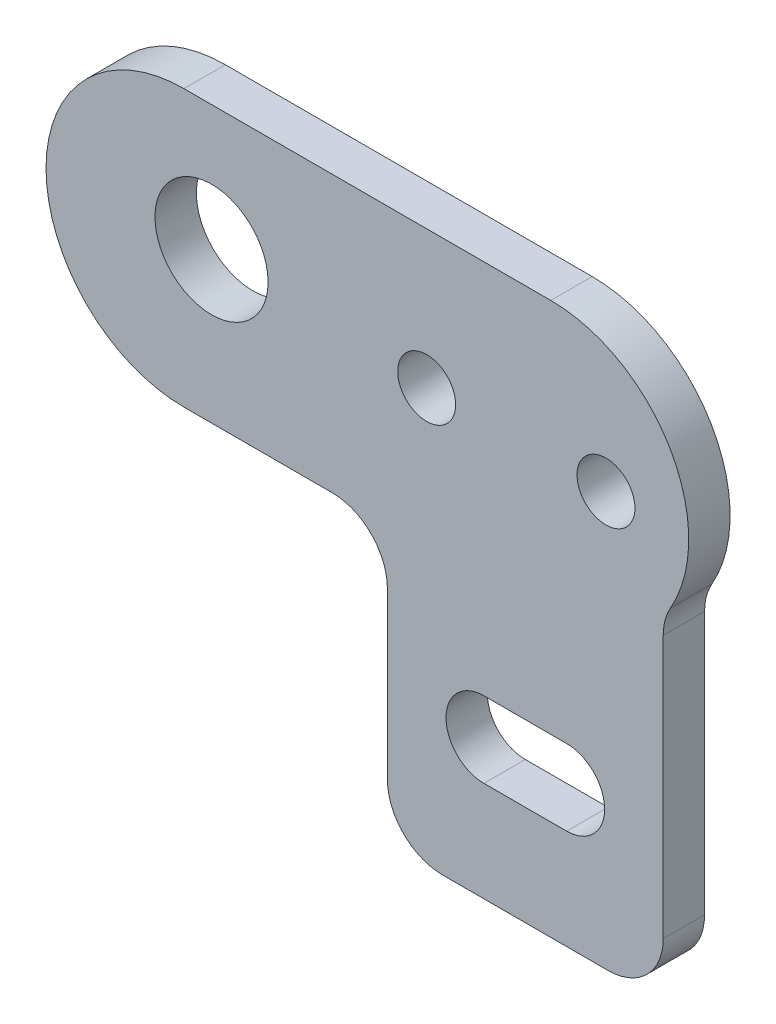
ISO-10303-21;
HEADER;
FILE_DESCRIPTION(('STEP AP214'),'2;1');
FILE_NAME('part.step','',(''),(''),'','','');
FILE_SCHEMA(('AUTOMOTIVE_DESIGN { 1 0 10303 214 1 1 1 1 }'));
ENDSEC;
DATA;
#1=APPLICATION_CONTEXT('core data for automotive mechanical design processes');
#2=APPLICATION_PROTOCOL_DEFINITION('international standard','automotive_design',2000,#1);
#3=PRODUCT_CONTEXT('',#1,'mechanical');
#4=PRODUCT('Part','Part','',(#3));
#5=PRODUCT_RELATED_PRODUCT_CATEGORY('part','',(#4));
#6=PRODUCT_DEFINITION_FORMATION('','',#4);
#7=PRODUCT_DEFINITION_CONTEXT('part definition',#1,'design');
#8=PRODUCT_DEFINITION('design','',#6,#7);
#9=PRODUCT_DEFINITION_SHAPE('','',#8);
#10=(LENGTH_UNIT() NAMED_UNIT(*) SI_UNIT(.MILLI.,.METRE.));
#11=(NAMED_UNIT(*) PLANE_ANGLE_UNIT() SI_UNIT($,.RADIAN.));
#12=(NAMED_UNIT(*) SI_UNIT($,.STERADIAN.) SOLID_ANGLE_UNIT());
#13=UNCERTAINTY_MEASURE_WITH_UNIT(LENGTH_MEASURE(1.E-05),#10,'distance_accuracy_value','');
#14=(GEOMETRIC_REPRESENTATION_CONTEXT(3) GLOBAL_UNCERTAINTY_ASSIGNED_CONTEXT((#13)) GLOBAL_UNIT_ASSIGNED_CONTEXT((#10,
#11,#12)) REPRESENTATION_CONTEXT('',''));
#15=CARTESIAN_POINT('',(0.,0.,0.));
#16=DIRECTION('',(0.,0.,1.));
#17=DIRECTION('',(1.,0.,0.));
#18=AXIS2_PLACEMENT_3D('',#15,#16,#17);
#19=CARTESIAN_POINT('',(0.,-10.,1.5));
#20=DIRECTION('',(0.,1.,0.));
#21=DIRECTION('',(0.,0.,1.));
#22=AXIS2_PLACEMENT_3D('',#19,#20,#21);
#23=PLANE('',#22);
#24=DIRECTION('',(1.,0.,0.));
#25=VECTOR('',#24,1.);
#26=CARTESIAN_POINT('',(0.,-10.,-1.5));
#27=LINE('',#26,#25);
#28=CARTESIAN_POINT('',(-13.3,-10.,-1.5));
#29=VERTEX_POINT('',#28);
#30=CARTESIAN_POINT('',(-2.55,-10.,-1.5));
#31=VERTEX_POINT('',#30);
#32=EDGE_CURVE('E198',#29,#31,#27,.T.);
#33=ORIENTED_EDGE('',*,*,#32,.T.);
#34=DIRECTION('',(0.,0.,-1.));
#35=VECTOR('',#34,1.);
#36=CARTESIAN_POINT('',(-2.55,-10.,1.5));
#37=LINE('',#36,#35);
#38=CARTESIAN_POINT('',(-2.55,-10.,1.5));
#39=VERTEX_POINT('',#38);
#40=EDGE_CURVE('E247',#31,#39,#37,.F.);
#41=ORIENTED_EDGE('',*,*,#40,.T.);
#42=DIRECTION('',(1.,0.,0.));
#43=VECTOR('',#42,1.);
#44=CARTESIAN_POINT('',(0.,-10.,1.5));
#45=LINE('',#44,#43);
#46=CARTESIAN_POINT('',(-13.3,-10.,1.5));
#47=VERTEX_POINT('',#46);
#48=EDGE_CURVE('E177',#47,#39,#45,.T.);
#49=ORIENTED_EDGE('',*,*,#48,.F.);
#50=DIRECTION('',(0.,0.,-1.));
#51=VECTOR('',#50,1.);
#52=CARTESIAN_POINT('',(-13.3,-10.,1.5));
#53=LINE('',#52,#51);
#54=EDGE_CURVE('E197',#47,#29,#53,.T.);
#55=ORIENTED_EDGE('',*,*,#54,.T.);
#56=EDGE_LOOP('',(#33,#41,#49,#55));
#57=FACE_BOUND('',#56,.T.);
#58=ADVANCED_FACE('F32',(#57),#23,.F.);
#59=CARTESIAN_POINT('',(1.45,0.,1.5));
#60=DIRECTION('',(1.,0.,0.));
#61=DIRECTION('',(0.,1.,0.));
#62=AXIS2_PLACEMENT_3D('',#59,#60,#61);
#63=PLANE('',#62);
#64=DIRECTION('',(0.,-1.,0.));
#65=VECTOR('',#64,1.);
#66=CARTESIAN_POINT('',(1.45,0.,-1.5));
#67=LINE('',#66,#65);
#68=CARTESIAN_POINT('',(1.45,-14.,-1.5));
#69=VERTEX_POINT('',#68);
#70=CARTESIAN_POINT('',(1.45,-26.,-1.5));
#71=VERTEX_POINT('',#70);
#72=EDGE_CURVE('E201',#69,#71,#67,.T.);
#73=ORIENTED_EDGE('',*,*,#72,.T.);
#74=DIRECTION('',(0.,0.,-1.));
#75=VECTOR('',#74,1.);
#76=CARTESIAN_POINT('',(1.45,-26.,1.5));
#77=LINE('',#76,#75);
#78=CARTESIAN_POINT('',(1.45,-26.,1.5));
#79=VERTEX_POINT('',#78);
#80=EDGE_CURVE('E245',#71,#79,#77,.F.);
#81=ORIENTED_EDGE('',*,*,#80,.T.);
#82=DIRECTION('',(0.,-1.,0.));
#83=VECTOR('',#82,1.);
#84=CARTESIAN_POINT('',(1.45,0.,1.5));
#85=LINE('',#84,#83);
#86=CARTESIAN_POINT('',(1.45,-14.,1.5));
#87=VERTEX_POINT('',#86);
#88=EDGE_CURVE('E180',#87,#79,#85,.T.);
#89=ORIENTED_EDGE('',*,*,#88,.F.);
#90=DIRECTION('',(0.,0.,-1.));
#91=VECTOR('',#90,1.);
#92=CARTESIAN_POINT('',(1.45,-14.,-1.5));
#93=LINE('',#92,#91);
#94=EDGE_CURVE('E242',#87,#69,#93,.T.);
#95=ORIENTED_EDGE('',*,*,#94,.T.);
#96=EDGE_LOOP('',(#73,#81,#89,#95));
#97=FACE_BOUND('',#96,.T.);
#98=ADVANCED_FACE('F291',(#97),#63,.F.);
#99=CARTESIAN_POINT('',(0.,-30.,1.5));
#100=DIRECTION('',(0.,1.,0.));
#101=DIRECTION('',(0.,0.,1.));
#102=AXIS2_PLACEMENT_3D('',#99,#100,#101);
#103=PLANE('',#102);
#104=DIRECTION('',(1.,0.,0.));
#105=VECTOR('',#104,1.);
#106=CARTESIAN_POINT('',(0.,-30.,-1.5));
#107=LINE('',#106,#105);
#108=CARTESIAN_POINT('',(5.45,-30.,-1.5));
#109=VERTEX_POINT('',#108);
#110=CARTESIAN_POINT('',(17.45,-30.,-1.5));
#111=VERTEX_POINT('',#110);
#112=EDGE_CURVE('E205',#109,#111,#107,.T.);
#113=ORIENTED_EDGE('',*,*,#112,.T.);
#114=DIRECTION('',(0.,0.,-1.));
#115=VECTOR('',#114,1.);
#116=CARTESIAN_POINT('',(17.45,-30.,1.5));
#117=LINE('',#116,#115);
#118=CARTESIAN_POINT('',(17.45,-30.,1.5));
#119=VERTEX_POINT('',#118);
#120=EDGE_CURVE('E236',#111,#119,#117,.F.);
#121=ORIENTED_EDGE('',*,*,#120,.T.);
#122=DIRECTION('',(1.,0.,0.));
#123=VECTOR('',#122,1.);
#124=CARTESIAN_POINT('',(0.,-30.,1.5));
#125=LINE('',#124,#123);
#126=CARTESIAN_POINT('',(5.45,-30.,1.5));
#127=VERTEX_POINT('',#126);
#128=EDGE_CURVE('E184',#127,#119,#125,.T.);
#129=ORIENTED_EDGE('',*,*,#128,.F.);
#130=DIRECTION('',(0.,0.,-1.));
#131=VECTOR('',#130,1.);
#132=CARTESIAN_POINT('',(5.45,-30.,1.5));
#133=LINE('',#132,#131);
#134=EDGE_CURVE('E233',#127,#109,#133,.T.);
#135=ORIENTED_EDGE('',*,*,#134,.T.);
#136=EDGE_LOOP('',(#113,#121,#129,#135));
#137=FACE_BOUND('',#136,.T.);
#138=ADVANCED_FACE('F300',(#137),#103,.F.);
#139=CARTESIAN_POINT('',(21.45,0.,1.5));
#140=DIRECTION('',(-1.,0.,0.));
#141=DIRECTION('',(0.,-1.,0.));
#142=AXIS2_PLACEMENT_3D('',#139,#140,#141);
#143=PLANE('',#142);
#144=DIRECTION('',(0.,1.,0.));
#145=VECTOR('',#144,1.);
#146=CARTESIAN_POINT('',(21.45,0.,1.5));
#147=LINE('',#146,#145);
#148=CARTESIAN_POINT('',(21.45,-26.,1.5));
#149=VERTEX_POINT('',#148);
#150=CARTESIAN_POINT('',(21.45,-6.95539359058852,1.5));
#151=VERTEX_POINT('',#150);
#152=EDGE_CURVE('E187',#149,#151,#147,.T.);
#153=ORIENTED_EDGE('',*,*,#152,.F.);
#154=DIRECTION('',(0.,0.,-1.));
#155=VECTOR('',#154,1.);
#156=CARTESIAN_POINT('',(21.45,-26.,1.5));
#157=LINE('',#156,#155);
#158=CARTESIAN_POINT('',(21.45,-26.,-1.5));
#159=VERTEX_POINT('',#158);
#160=EDGE_CURVE('E226',#149,#159,#157,.T.);
#161=ORIENTED_EDGE('',*,*,#160,.T.);
#162=DIRECTION('',(0.,1.,0.));
#163=VECTOR('',#162,1.);
#164=CARTESIAN_POINT('',(21.45,0.,-1.5));
#165=LINE('',#164,#163);
#166=CARTESIAN_POINT('',(21.45,-6.95539359058852,-1.5));
#167=VERTEX_POINT('',#166);
#168=EDGE_CURVE('E208',#159,#167,#165,.T.);
#169=ORIENTED_EDGE('',*,*,#168,.T.);
#170=DIRECTION('',(0.,0.,1.));
#171=VECTOR('',#170,1.);
#172=CARTESIAN_POINT('',(21.45,-6.95539359058852,1.5));
#173=LINE('',#172,#171);
#174=EDGE_CURVE('E224',#167,#151,#173,.T.);
#175=ORIENTED_EDGE('',*,*,#174,.T.);
#176=EDGE_LOOP('',(#153,#161,#169,#175));
#177=FACE_BOUND('',#176,.T.);
#178=ADVANCED_FACE('F262',(#177),#143,.F.);
#179=CARTESIAN_POINT('',(13.3,0.,1.5));
#180=DIRECTION('',(0.,0.,-1.));
#181=DIRECTION('',(-1.,0.,0.));
#182=AXIS2_PLACEMENT_3D('',#179,#180,#181);
#183=CYLINDRICAL_SURFACE('',#182,10.);
#184=CARTESIAN_POINT('',(13.3,0.,1.5));
#185=DIRECTION('',(0.,0.,1.));
#186=DIRECTION('',(1.,0.,0.));
#187=AXIS2_PLACEMENT_3D('',#184,#185,#186);
#188=CIRCLE('',#187,10.);
#189=CARTESIAN_POINT('',(21.9785714285714,-4.9681382789918,1.5));
#190=VERTEX_POINT('',#189);
#191=CARTESIAN_POINT('',(13.3,10.,1.5));
#192=VERTEX_POINT('',#191);
#193=EDGE_CURVE('E190',#190,#192,#188,.T.);
#194=ORIENTED_EDGE('',*,*,#193,.F.);
#195=DIRECTION('',(0.,0.,-1.));
#196=VECTOR('',#195,1.);
#197=CARTESIAN_POINT('',(21.9785714285714,-4.9681382789918,1.5));
#198=LINE('',#197,#196);
#199=CARTESIAN_POINT('',(21.9785714285714,-4.9681382789918,-1.5));
#200=VERTEX_POINT('',#199);
#201=EDGE_CURVE('E249',#190,#200,#198,.T.);
#202=ORIENTED_EDGE('',*,*,#201,.T.);
#203=CARTESIAN_POINT('',(13.3,0.,-1.5));
#204=DIRECTION('',(0.,0.,1.));
#205=DIRECTION('',(1.,0.,0.));
#206=AXIS2_PLACEMENT_3D('',#203,#204,#205);
#207=CIRCLE('',#206,10.);
#208=CARTESIAN_POINT('',(13.3,10.,-1.5));
#209=VERTEX_POINT('',#208);
#210=EDGE_CURVE('E211',#200,#209,#207,.T.);
#211=ORIENTED_EDGE('',*,*,#210,.T.);
#212=DIRECTION('',(0.,0.,-1.));
#213=VECTOR('',#212,1.);
#214=CARTESIAN_POINT('',(13.3,10.,1.5));
#215=LINE('',#214,#213);
#216=EDGE_CURVE('E221',#192,#209,#215,.T.);
#217=ORIENTED_EDGE('',*,*,#216,.F.);
#218=EDGE_LOOP('',(#194,#202,#211,#217));
#219=FACE_BOUND('',#218,.T.);
#220=ADVANCED_FACE('F271',(#219),#183,.T.);
#221=CARTESIAN_POINT('',(0.,10.,1.5));
#222=DIRECTION('',(0.,1.,0.));
#223=DIRECTION('',(0.,0.,1.));
#224=AXIS2_PLACEMENT_3D('',#221,#222,#223);
#225=PLANE('',#224);
#226=DIRECTION('',(1.,0.,0.));
#227=VECTOR('',#226,1.);
#228=CARTESIAN_POINT('',(0.,10.,-1.5));
#229=LINE('',#228,#227);
#230=CARTESIAN_POINT('',(-13.3,10.,-1.5));
#231=VERTEX_POINT('',#230);
#232=EDGE_CURVE('E213',#231,#209,#229,.T.);
#233=ORIENTED_EDGE('',*,*,#232,.F.);
#234=DIRECTION('',(0.,0.,-1.));
#235=VECTOR('',#234,1.);
#236=CARTESIAN_POINT('',(-13.3,10.,1.5));
#237=LINE('',#236,#235);
#238=CARTESIAN_POINT('',(-13.3,10.,1.5));
#239=VERTEX_POINT('',#238);
#240=EDGE_CURVE('E219',#239,#231,#237,.T.);
#241=ORIENTED_EDGE('',*,*,#240,.F.);
#242=DIRECTION('',(1.,0.,0.));
#243=VECTOR('',#242,1.);
#244=CARTESIAN_POINT('',(0.,10.,1.5));
#245=LINE('',#244,#243);
#246=EDGE_CURVE('E192',#239,#192,#245,.T.);
#247=ORIENTED_EDGE('',*,*,#246,.T.);
#248=ORIENTED_EDGE('',*,*,#216,.T.);
#249=EDGE_LOOP('',(#233,#241,#247,#248));
#250=FACE_BOUND('',#249,.T.);
#251=ADVANCED_FACE('F274',(#250),#225,.T.);
#252=CARTESIAN_POINT('',(-13.3,0.,1.5));
#253=DIRECTION('',(0.,0.,-1.));
#254=DIRECTION('',(-1.,0.,0.));
#255=AXIS2_PLACEMENT_3D('',#252,#253,#254);
#256=CYLINDRICAL_SURFACE('',#255,10.);
#257=CARTESIAN_POINT('',(-13.3,0.,-1.5));
#258=DIRECTION('',(0.,0.,1.));
#259=DIRECTION('',(1.,0.,0.));
#260=AXIS2_PLACEMENT_3D('',#257,#258,#259);
#261=CIRCLE('',#260,10.);
#262=EDGE_CURVE('E181',#231,#29,#261,.T.);
#263=ORIENTED_EDGE('',*,*,#262,.T.);
#264=ORIENTED_EDGE('',*,*,#54,.F.);
#265=CARTESIAN_POINT('',(-13.3,0.,1.5));
#266=DIRECTION('',(0.,0.,1.));
#267=DIRECTION('',(1.,0.,0.));
#268=AXIS2_PLACEMENT_3D('',#265,#266,#267);
#269=CIRCLE('',#268,10.);
#270=EDGE_CURVE('E195',#239,#47,#269,.T.);
#271=ORIENTED_EDGE('',*,*,#270,.F.);
#272=ORIENTED_EDGE('',*,*,#240,.T.);
#273=EDGE_LOOP('',(#263,#264,#271,#272));
#274=FACE_BOUND('',#273,.T.);
#275=ADVANCED_FACE('F280',(#274),#256,.T.);
#276=CARTESIAN_POINT('',(0.,0.,1.5));
#277=DIRECTION('',(0.,0.,1.));
#278=DIRECTION('',(1.,0.,0.));
#279=AXIS2_PLACEMENT_3D('',#276,#277,#278);
#280=PLANE('',#279);
#281=CARTESIAN_POINT('',(-11.3,0.9,1.5));
#282=DIRECTION('',(0.,0.,1.));
#283=DIRECTION('',(1.,0.,0.));
#284=AXIS2_PLACEMENT_3D('',#281,#282,#283);
#285=CIRCLE('',#284,4.1);
#286=CARTESIAN_POINT('',(-7.2,0.9,1.5));
#287=VERTEX_POINT('',#286);
#288=EDGE_CURVE('E363',#287,#287,#285,.T.);
#289=ORIENTED_EDGE('',*,*,#288,.F.);
#290=EDGE_LOOP('',(#289));
#291=FACE_BOUND('',#290,.T.);
#292=CARTESIAN_POINT('',(4.3,0.,1.5));
#293=DIRECTION('',(0.,0.,1.));
#294=DIRECTION('',(1.,0.,0.));
#295=AXIS2_PLACEMENT_3D('',#292,#293,#294);
#296=CIRCLE('',#295,2.1);
#297=CARTESIAN_POINT('',(6.4,0.,1.5));
#298=VERTEX_POINT('',#297);
#299=EDGE_CURVE('E368',#298,#298,#296,.T.);
#300=ORIENTED_EDGE('',*,*,#299,.F.);
#301=EDGE_LOOP('',(#300));
#302=FACE_BOUND('',#301,.T.);
#303=CARTESIAN_POINT('',(17.3,0.,1.5));
#304=DIRECTION('',(0.,0.,1.));
#305=DIRECTION('',(1.,0.,0.));
#306=AXIS2_PLACEMENT_3D('',#303,#304,#305);
#307=CIRCLE('',#306,2.1);
#308=CARTESIAN_POINT('',(19.4,0.,1.5));
#309=VERTEX_POINT('',#308);
#310=EDGE_CURVE('E162',#309,#309,#307,.T.);
#311=ORIENTED_EDGE('',*,*,#310,.F.);
#312=EDGE_LOOP('',(#311));
#313=FACE_BOUND('',#312,.T.);
#314=CARTESIAN_POINT('',(8.45,-20.,1.5));
#315=DIRECTION('',(0.,0.,1.));
#316=DIRECTION('',(1.,0.,0.));
#317=AXIS2_PLACEMENT_3D('',#314,#315,#316);
#318=CIRCLE('',#317,2.75);
#319=CARTESIAN_POINT('',(8.45,-17.25,1.5));
#320=VERTEX_POINT('',#319);
#321=CARTESIAN_POINT('',(8.45,-22.75,1.5));
#322=VERTEX_POINT('',#321);
#323=EDGE_CURVE('E47',#320,#322,#318,.T.);
#324=ORIENTED_EDGE('',*,*,#323,.F.);
#325=DIRECTION('',(-1.,0.,0.));
#326=VECTOR('',#325,1.);
#327=CARTESIAN_POINT('',(8.45,-17.25,1.5));
#328=LINE('',#327,#326);
#329=CARTESIAN_POINT('',(14.45,-17.25,1.5));
#330=VERTEX_POINT('',#329);
#331=EDGE_CURVE('E156',#330,#320,#328,.T.);
#332=ORIENTED_EDGE('',*,*,#331,.F.);
#333=CARTESIAN_POINT('',(14.45,-20.,1.5));
#334=DIRECTION('',(0.,0.,1.));
#335=DIRECTION('',(1.,0.,0.));
#336=AXIS2_PLACEMENT_3D('',#333,#334,#335);
#337=CIRCLE('',#336,2.75);
#338=CARTESIAN_POINT('',(14.45,-22.75,1.5));
#339=VERTEX_POINT('',#338);
#340=EDGE_CURVE('E159',#339,#330,#337,.T.);
#341=ORIENTED_EDGE('',*,*,#340,.F.);
#342=DIRECTION('',(1.,0.,0.));
#343=VECTOR('',#342,1.);
#344=CARTESIAN_POINT('',(8.45,-22.75,1.5));
#345=LINE('',#344,#343);
#346=EDGE_CURVE('E168',#322,#339,#345,.T.);
#347=ORIENTED_EDGE('',*,*,#346,.F.);
#348=EDGE_LOOP('',(#324,#332,#341,#347));
#349=FACE_BOUND('',#348,.T.);
#350=ORIENTED_EDGE('',*,*,#128,.T.);
#351=CARTESIAN_POINT('',(17.45,-26.,1.5));
#352=DIRECTION('',(0.,0.,1.));
#353=DIRECTION('',(1.,0.,0.));
#354=AXIS2_PLACEMENT_3D('',#351,#352,#353);
#355=CIRCLE('',#354,4.);
#356=EDGE_CURVE('E240',#119,#149,#355,.T.);
#357=ORIENTED_EDGE('',*,*,#356,.T.);
#358=ORIENTED_EDGE('',*,*,#152,.T.);
#359=CARTESIAN_POINT('',(25.45,-6.95539359058852,1.5));
#360=DIRECTION('',(0.,0.,1.));
#361=DIRECTION('',(1.,0.,0.));
#362=AXIS2_PLACEMENT_3D('',#359,#360,#361);
#363=CIRCLE('',#362,4.);
#364=EDGE_CURVE('E11',#151,#190,#363,.F.);
#365=ORIENTED_EDGE('',*,*,#364,.T.);
#366=ORIENTED_EDGE('',*,*,#193,.T.);
#367=ORIENTED_EDGE('',*,*,#246,.F.);
#368=ORIENTED_EDGE('',*,*,#270,.T.);
#369=ORIENTED_EDGE('',*,*,#48,.T.);
#370=CARTESIAN_POINT('',(-2.55,-14.,1.5));
#371=DIRECTION('',(0.,0.,1.));
#372=DIRECTION('',(1.,0.,0.));
#373=AXIS2_PLACEMENT_3D('',#370,#371,#372);
#374=CIRCLE('',#373,4.);
#375=EDGE_CURVE('E254',#39,#87,#374,.F.);
#376=ORIENTED_EDGE('',*,*,#375,.T.);
#377=ORIENTED_EDGE('',*,*,#88,.T.);
#378=CARTESIAN_POINT('',(5.45,-26.,1.5));
#379=DIRECTION('',(0.,0.,1.));
#380=DIRECTION('',(1.,0.,0.));
#381=AXIS2_PLACEMENT_3D('',#378,#379,#380);
#382=CIRCLE('',#381,4.);
#383=EDGE_CURVE('E238',#79,#127,#382,.T.);
#384=ORIENTED_EDGE('',*,*,#383,.T.);
#385=EDGE_LOOP('',(#350,#357,#358,#365,#366,#367,#368,#369,#376,#377,#384));
#386=FACE_BOUND('',#385,.T.);
#387=ADVANCED_FACE('F267',(#291,#302,#313,#349,#386),#280,.T.);
#388=CARTESIAN_POINT('',(0.,0.,-1.5));
#389=DIRECTION('',(0.,0.,1.));
#390=DIRECTION('',(1.,0.,0.));
#391=AXIS2_PLACEMENT_3D('',#388,#389,#390);
#392=PLANE('',#391);
#393=CARTESIAN_POINT('',(-11.3,0.9,-1.5));
#394=DIRECTION('',(0.,0.,1.));
#395=DIRECTION('',(1.,0.,0.));
#396=AXIS2_PLACEMENT_3D('',#393,#394,#395);
#397=CIRCLE('',#396,4.1);
#398=CARTESIAN_POINT('',(-7.2,0.9,-1.5));
#399=VERTEX_POINT('',#398);
#400=EDGE_CURVE('E202',#399,#399,#397,.T.);
#401=ORIENTED_EDGE('',*,*,#400,.T.);
#402=EDGE_LOOP('',(#401));
#403=FACE_BOUND('',#402,.T.);
#404=CARTESIAN_POINT('',(4.3,0.,-1.5));
#405=DIRECTION('',(0.,0.,1.));
#406=DIRECTION('',(1.,0.,0.));
#407=AXIS2_PLACEMENT_3D('',#404,#405,#406);
#408=CIRCLE('',#407,2.1);
#409=CARTESIAN_POINT('',(6.4,0.,-1.5));
#410=VERTEX_POINT('',#409);
#411=EDGE_CURVE('E364',#410,#410,#408,.T.);
#412=ORIENTED_EDGE('',*,*,#411,.T.);
#413=EDGE_LOOP('',(#412));
#414=FACE_BOUND('',#413,.T.);
#415=CARTESIAN_POINT('',(17.3,0.,-1.5));
#416=DIRECTION('',(0.,0.,1.));
#417=DIRECTION('',(1.,0.,0.));
#418=AXIS2_PLACEMENT_3D('',#415,#416,#417);
#419=CIRCLE('',#418,2.1);
#420=CARTESIAN_POINT('',(19.4,0.,-1.5));
#421=VERTEX_POINT('',#420);
#422=EDGE_CURVE('E372',#421,#421,#419,.T.);
#423=ORIENTED_EDGE('',*,*,#422,.T.);
#424=EDGE_LOOP('',(#423));
#425=FACE_BOUND('',#424,.T.);
#426=DIRECTION('',(-1.,0.,0.));
#427=VECTOR('',#426,1.);
#428=CARTESIAN_POINT('',(8.45,-17.25,-1.5));
#429=LINE('',#428,#427);
#430=CARTESIAN_POINT('',(14.45,-17.25,-1.5));
#431=VERTEX_POINT('',#430);
#432=CARTESIAN_POINT('',(8.45,-17.25,-1.5));
#433=VERTEX_POINT('',#432);
#434=EDGE_CURVE('E146',#431,#433,#429,.T.);
#435=ORIENTED_EDGE('',*,*,#434,.T.);
#436=CARTESIAN_POINT('',(8.45,-20.,-1.5));
#437=DIRECTION('',(0.,0.,1.));
#438=DIRECTION('',(1.,0.,0.));
#439=AXIS2_PLACEMENT_3D('',#436,#437,#438);
#440=CIRCLE('',#439,2.75);
#441=CARTESIAN_POINT('',(8.45,-22.75,-1.5));
#442=VERTEX_POINT('',#441);
#443=EDGE_CURVE('E140',#433,#442,#440,.T.);
#444=ORIENTED_EDGE('',*,*,#443,.T.);
#445=DIRECTION('',(1.,0.,0.));
#446=VECTOR('',#445,1.);
#447=CARTESIAN_POINT('',(8.45,-22.75,-1.5));
#448=LINE('',#447,#446);
#449=CARTESIAN_POINT('',(14.45,-22.75,-1.5));
#450=VERTEX_POINT('',#449);
#451=EDGE_CURVE('E149',#442,#450,#448,.T.);
#452=ORIENTED_EDGE('',*,*,#451,.T.);
#453=CARTESIAN_POINT('',(14.45,-20.,-1.5));
#454=DIRECTION('',(0.,0.,1.));
#455=DIRECTION('',(1.,0.,0.));
#456=AXIS2_PLACEMENT_3D('',#453,#454,#455);
#457=CIRCLE('',#456,2.75);
#458=EDGE_CURVE('E55',#450,#431,#457,.T.);
#459=ORIENTED_EDGE('',*,*,#458,.T.);
#460=EDGE_LOOP('',(#435,#444,#452,#459));
#461=FACE_BOUND('',#460,.T.);
#462=ORIENTED_EDGE('',*,*,#168,.F.);
#463=CARTESIAN_POINT('',(17.45,-26.,-1.5));
#464=DIRECTION('',(0.,0.,1.));
#465=DIRECTION('',(1.,0.,0.));
#466=AXIS2_PLACEMENT_3D('',#463,#464,#465);
#467=CIRCLE('',#466,4.);
#468=EDGE_CURVE('E231',#159,#111,#467,.F.);
#469=ORIENTED_EDGE('',*,*,#468,.T.);
#470=ORIENTED_EDGE('',*,*,#112,.F.);
#471=CARTESIAN_POINT('',(5.45,-26.,-1.5));
#472=DIRECTION('',(0.,0.,1.));
#473=DIRECTION('',(1.,0.,0.));
#474=AXIS2_PLACEMENT_3D('',#471,#472,#473);
#475=CIRCLE('',#474,4.);
#476=EDGE_CURVE('E229',#109,#71,#475,.F.);
#477=ORIENTED_EDGE('',*,*,#476,.T.);
#478=ORIENTED_EDGE('',*,*,#72,.F.);
#479=CARTESIAN_POINT('',(-2.55,-14.,-1.5));
#480=DIRECTION('',(0.,0.,1.));
#481=DIRECTION('',(1.,0.,0.));
#482=AXIS2_PLACEMENT_3D('',#479,#480,#481);
#483=CIRCLE('',#482,4.);
#484=EDGE_CURVE('E252',#69,#31,#483,.T.);
#485=ORIENTED_EDGE('',*,*,#484,.T.);
#486=ORIENTED_EDGE('',*,*,#32,.F.);
#487=ORIENTED_EDGE('',*,*,#262,.F.);
#488=ORIENTED_EDGE('',*,*,#232,.T.);
#489=ORIENTED_EDGE('',*,*,#210,.F.);
#490=CARTESIAN_POINT('',(25.45,-6.95539359058852,-1.5));
#491=DIRECTION('',(0.,0.,1.));
#492=DIRECTION('',(1.,0.,0.));
#493=AXIS2_PLACEMENT_3D('',#490,#491,#492);
#494=CIRCLE('',#493,4.);
#495=EDGE_CURVE('E40',#200,#167,#494,.T.);
#496=ORIENTED_EDGE('',*,*,#495,.T.);
#497=EDGE_LOOP('',(#462,#469,#470,#477,#478,#485,#486,#487,#488,#489,#496));
#498=FACE_BOUND('',#497,.T.);
#499=ADVANCED_FACE('F153',(#403,#414,#425,#461,#498),#392,.F.);
#500=CARTESIAN_POINT('',(17.45,-26.,1.5));
#501=DIRECTION('',(0.,0.,-1.));
#502=DIRECTION('',(-1.,0.,0.));
#503=AXIS2_PLACEMENT_3D('',#500,#501,#502);
#504=CYLINDRICAL_SURFACE('',#503,4.);
#505=ORIENTED_EDGE('',*,*,#356,.F.);
#506=ORIENTED_EDGE('',*,*,#120,.F.);
#507=ORIENTED_EDGE('',*,*,#468,.F.);
#508=ORIENTED_EDGE('',*,*,#160,.F.);
#509=EDGE_LOOP('',(#505,#506,#507,#508));
#510=FACE_BOUND('',#509,.T.);
#511=ADVANCED_FACE('F304',(#510),#504,.T.);
#512=CARTESIAN_POINT('',(5.45,-26.,1.5));
#513=DIRECTION('',(0.,0.,-1.));
#514=DIRECTION('',(-1.,0.,0.));
#515=AXIS2_PLACEMENT_3D('',#512,#513,#514);
#516=CYLINDRICAL_SURFACE('',#515,4.);
#517=ORIENTED_EDGE('',*,*,#383,.F.);
#518=ORIENTED_EDGE('',*,*,#80,.F.);
#519=ORIENTED_EDGE('',*,*,#476,.F.);
#520=ORIENTED_EDGE('',*,*,#134,.F.);
#521=EDGE_LOOP('',(#517,#518,#519,#520));
#522=FACE_BOUND('',#521,.T.);
#523=ADVANCED_FACE('F295',(#522),#516,.T.);
#524=CARTESIAN_POINT('',(-2.55,-14.,1.5));
#525=DIRECTION('',(0.,0.,1.));
#526=DIRECTION('',(1.,0.,0.));
#527=AXIS2_PLACEMENT_3D('',#524,#525,#526);
#528=CYLINDRICAL_SURFACE('',#527,4.);
#529=ORIENTED_EDGE('',*,*,#375,.F.);
#530=ORIENTED_EDGE('',*,*,#40,.F.);
#531=ORIENTED_EDGE('',*,*,#484,.F.);
#532=ORIENTED_EDGE('',*,*,#94,.F.);
#533=EDGE_LOOP('',(#529,#530,#531,#532));
#534=FACE_BOUND('',#533,.T.);
#535=ADVANCED_FACE('F286',(#534),#528,.F.);
#536=CARTESIAN_POINT('',(25.45,-6.95539359058852,1.5));
#537=DIRECTION('',(0.,0.,-1.));
#538=DIRECTION('',(-1.,0.,0.));
#539=AXIS2_PLACEMENT_3D('',#536,#537,#538);
#540=CYLINDRICAL_SURFACE('',#539,4.);
#541=ORIENTED_EDGE('',*,*,#364,.F.);
#542=ORIENTED_EDGE('',*,*,#174,.F.);
#543=ORIENTED_EDGE('',*,*,#495,.F.);
#544=ORIENTED_EDGE('',*,*,#201,.F.);
#545=EDGE_LOOP('',(#541,#542,#543,#544));
#546=FACE_BOUND('',#545,.T.);
#547=ADVANCED_FACE('F34',(#546),#540,.F.);
#548=CARTESIAN_POINT('',(8.45,-20.,-1.5));
#549=DIRECTION('',(0.,0.,1.));
#550=DIRECTION('',(1.,0.,0.));
#551=AXIS2_PLACEMENT_3D('',#548,#549,#550);
#552=CYLINDRICAL_SURFACE('',#551,2.75);
#553=ORIENTED_EDGE('',*,*,#323,.T.);
#554=DIRECTION('',(0.,0.,1.));
#555=VECTOR('',#554,1.);
#556=CARTESIAN_POINT('',(8.45,-22.75,-1.5));
#557=LINE('',#556,#555);
#558=EDGE_CURVE('E136',#442,#322,#557,.T.);
#559=ORIENTED_EDGE('',*,*,#558,.F.);
#560=ORIENTED_EDGE('',*,*,#443,.F.);
#561=DIRECTION('',(0.,0.,1.));
#562=VECTOR('',#561,1.);
#563=CARTESIAN_POINT('',(8.45,-17.25,-1.5));
#564=LINE('',#563,#562);
#565=EDGE_CURVE('E172',#433,#320,#564,.T.);
#566=ORIENTED_EDGE('',*,*,#565,.T.);
#567=EDGE_LOOP('',(#553,#559,#560,#566));
#568=FACE_BOUND('',#567,.T.);
#569=ADVANCED_FACE('F138',(#568),#552,.F.);
#570=CARTESIAN_POINT('',(8.45,-17.25,-1.5));
#571=DIRECTION('',(0.,1.,0.));
#572=DIRECTION('',(0.,0.,1.));
#573=AXIS2_PLACEMENT_3D('',#570,#571,#572);
#574=PLANE('',#573);
#575=ORIENTED_EDGE('',*,*,#331,.T.);
#576=ORIENTED_EDGE('',*,*,#565,.F.);
#577=ORIENTED_EDGE('',*,*,#434,.F.);
#578=DIRECTION('',(0.,0.,1.));
#579=VECTOR('',#578,1.);
#580=CARTESIAN_POINT('',(14.45,-17.25,-1.5));
#581=LINE('',#580,#579);
#582=EDGE_CURVE('E174',#431,#330,#581,.T.);
#583=ORIENTED_EDGE('',*,*,#582,.T.);
#584=EDGE_LOOP('',(#575,#576,#577,#583));
#585=FACE_BOUND('',#584,.T.);
#586=ADVANCED_FACE('F336',(#585),#574,.F.);
#587=CARTESIAN_POINT('',(14.45,-20.,-1.5));
#588=DIRECTION('',(0.,0.,1.));
#589=DIRECTION('',(1.,0.,0.));
#590=AXIS2_PLACEMENT_3D('',#587,#588,#589);
#591=CYLINDRICAL_SURFACE('',#590,2.75);
#592=ORIENTED_EDGE('',*,*,#340,.T.);
#593=ORIENTED_EDGE('',*,*,#582,.F.);
#594=ORIENTED_EDGE('',*,*,#458,.F.);
#595=DIRECTION('',(0.,0.,1.));
#596=VECTOR('',#595,1.);
#597=CARTESIAN_POINT('',(14.45,-22.75,-1.5));
#598=LINE('',#597,#596);
#599=EDGE_CURVE('E145',#450,#339,#598,.T.);
#600=ORIENTED_EDGE('',*,*,#599,.T.);
#601=EDGE_LOOP('',(#592,#593,#594,#600));
#602=FACE_BOUND('',#601,.T.);
#603=ADVANCED_FACE('F340',(#602),#591,.F.);
#604=CARTESIAN_POINT('',(8.45,-22.75,-1.5));
#605=DIRECTION('',(0.,-1.,0.));
#606=DIRECTION('',(0.,0.,-1.));
#607=AXIS2_PLACEMENT_3D('',#604,#605,#606);
#608=PLANE('',#607);
#609=ORIENTED_EDGE('',*,*,#346,.T.);
#610=ORIENTED_EDGE('',*,*,#599,.F.);
#611=ORIENTED_EDGE('',*,*,#451,.F.);
#612=ORIENTED_EDGE('',*,*,#558,.T.);
#613=EDGE_LOOP('',(#609,#610,#611,#612));
#614=FACE_BOUND('',#613,.T.);
#615=ADVANCED_FACE('F150',(#614),#608,.F.);
#616=CARTESIAN_POINT('',(17.3,0.,-1.5));
#617=DIRECTION('',(0.,0.,1.));
#618=DIRECTION('',(1.,0.,0.));
#619=AXIS2_PLACEMENT_3D('',#616,#617,#618);
#620=CYLINDRICAL_SURFACE('',#619,2.1);
#621=ORIENTED_EDGE('',*,*,#422,.F.);
#622=EDGE_LOOP('',(#621));
#623=FACE_BOUND('',#622,.T.);
#624=ORIENTED_EDGE('',*,*,#310,.T.);
#625=EDGE_LOOP('',(#624));
#626=FACE_BOUND('',#625,.T.);
#627=ADVANCED_FACE('F339',(#623,#626),#620,.F.);
#628=CARTESIAN_POINT('',(4.3,0.,-1.5));
#629=DIRECTION('',(0.,0.,1.));
#630=DIRECTION('',(1.,0.,0.));
#631=AXIS2_PLACEMENT_3D('',#628,#629,#630);
#632=CYLINDRICAL_SURFACE('',#631,2.1);
#633=ORIENTED_EDGE('',*,*,#411,.F.);
#634=EDGE_LOOP('',(#633));
#635=FACE_BOUND('',#634,.T.);
#636=ORIENTED_EDGE('',*,*,#299,.T.);
#637=EDGE_LOOP('',(#636));
#638=FACE_BOUND('',#637,.T.);
#639=ADVANCED_FACE('F348',(#635,#638),#632,.F.);
#640=CARTESIAN_POINT('',(-11.3,0.9,-1.5));
#641=DIRECTION('',(0.,0.,1.));
#642=DIRECTION('',(1.,0.,0.));
#643=AXIS2_PLACEMENT_3D('',#640,#641,#642);
#644=CYLINDRICAL_SURFACE('',#643,4.1);
#645=ORIENTED_EDGE('',*,*,#400,.F.);
#646=EDGE_LOOP('',(#645));
#647=FACE_BOUND('',#646,.T.);
#648=ORIENTED_EDGE('',*,*,#288,.T.);
#649=EDGE_LOOP('',(#648));
#650=FACE_BOUND('',#649,.T.);
#651=ADVANCED_FACE('F352',(#647,#650),#644,.F.);
#652=CLOSED_SHELL('',(#58,#98,#138,#178,#220,#251,#275,#387,#499,#511,#523,#535,#547,#569,#586,
#603,#615,#627,#639,#651));
#653=MANIFOLD_SOLID_BREP('B2',#652);
#654=ADVANCED_BREP_SHAPE_REPRESENTATION('',(#18,#653),#14);
#655=SHAPE_DEFINITION_REPRESENTATION(#9,#654);
ENDSEC;
END-ISO-10303-21;
